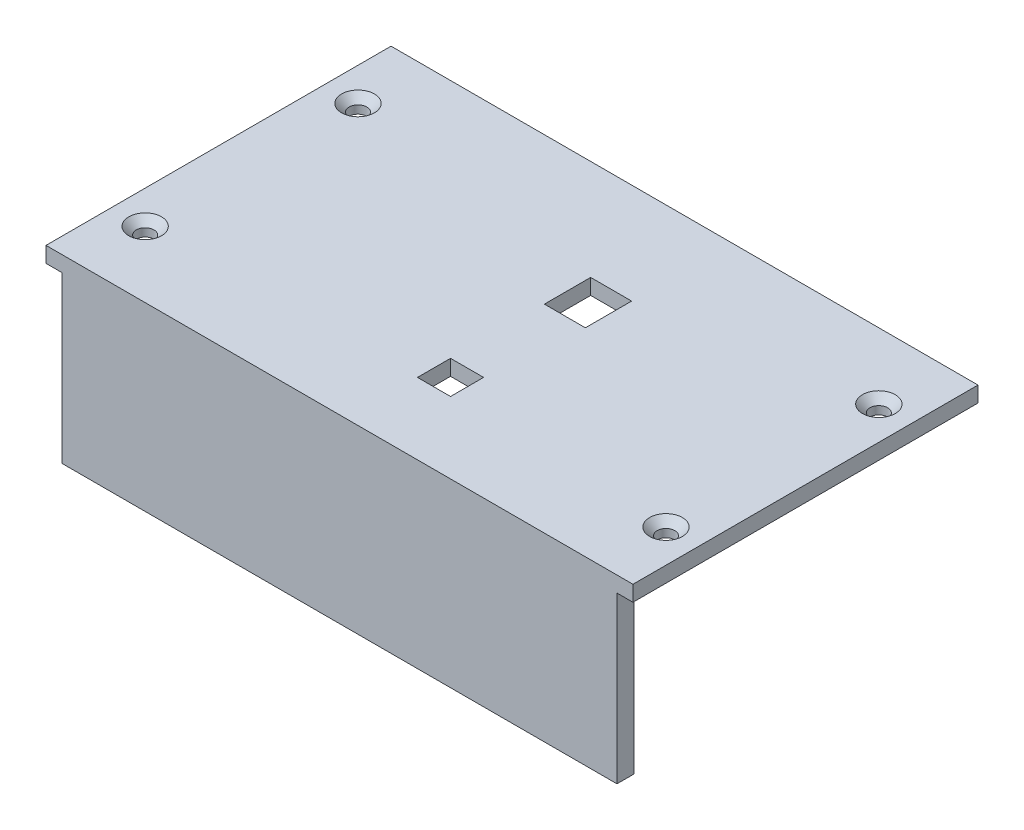
ISO-10303-21;
HEADER;
FILE_DESCRIPTION(('STEP AP214'),'2;1');
FILE_NAME('part.step','',(''),(''),'','','');
FILE_SCHEMA(('AUTOMOTIVE_DESIGN { 1 0 10303 214 1 1 1 1 }'));
ENDSEC;
DATA;
#1=APPLICATION_CONTEXT('core data for automotive mechanical design processes');
#2=APPLICATION_PROTOCOL_DEFINITION('international standard','automotive_design',2000,#1);
#3=PRODUCT_CONTEXT('',#1,'mechanical');
#4=PRODUCT('Part','Part','',(#3));
#5=PRODUCT_RELATED_PRODUCT_CATEGORY('part','',(#4));
#6=PRODUCT_DEFINITION_FORMATION('','',#4);
#7=PRODUCT_DEFINITION_CONTEXT('part definition',#1,'design');
#8=PRODUCT_DEFINITION('design','',#6,#7);
#9=PRODUCT_DEFINITION_SHAPE('','',#8);
#10=(LENGTH_UNIT() NAMED_UNIT(*) SI_UNIT(.MILLI.,.METRE.));
#11=(NAMED_UNIT(*) PLANE_ANGLE_UNIT() SI_UNIT($,.RADIAN.));
#12=(NAMED_UNIT(*) SI_UNIT($,.STERADIAN.) SOLID_ANGLE_UNIT());
#13=UNCERTAINTY_MEASURE_WITH_UNIT(LENGTH_MEASURE(1.E-05),#10,'distance_accuracy_value','');
#14=(GEOMETRIC_REPRESENTATION_CONTEXT(3) GLOBAL_UNCERTAINTY_ASSIGNED_CONTEXT((#13)) GLOBAL_UNIT_ASSIGNED_CONTEXT((#10,
#11,#12)) REPRESENTATION_CONTEXT('',''));
#15=CARTESIAN_POINT('',(0.,0.,0.));
#16=DIRECTION('',(0.,0.,1.));
#17=DIRECTION('',(1.,0.,0.));
#18=AXIS2_PLACEMENT_3D('',#15,#16,#17);
#19=CARTESIAN_POINT('',(0.,0.,0.));
#20=DIRECTION('',(0.,1.,0.));
#21=DIRECTION('',(0.,0.,1.));
#22=AXIS2_PLACEMENT_3D('',#19,#20,#21);
#23=PLANE('',#22);
#24=DIRECTION('',(1.,0.,0.));
#25=VECTOR('',#24,1.);
#26=CARTESIAN_POINT('',(1.27000000000001,0.,13.081));
#27=LINE('',#26,#25);
#28=CARTESIAN_POINT('',(1.27000000000001,0.,13.081));
#29=VERTEX_POINT('',#28);
#30=CARTESIAN_POINT('',(7.62000000000001,0.,13.081));
#31=VERTEX_POINT('',#30);
#32=EDGE_CURVE('E178',#29,#31,#27,.T.);
#33=ORIENTED_EDGE('',*,*,#32,.F.);
#34=DIRECTION('',(0.,0.,-1.));
#35=VECTOR('',#34,1.);
#36=CARTESIAN_POINT('',(1.27000000000001,0.,13.081));
#37=LINE('',#36,#35);
#38=CARTESIAN_POINT('',(1.27000000000001,0.,19.431));
#39=VERTEX_POINT('',#38);
#40=EDGE_CURVE('E157',#39,#29,#37,.T.);
#41=ORIENTED_EDGE('',*,*,#40,.F.);
#42=DIRECTION('',(-1.,0.,0.));
#43=VECTOR('',#42,1.);
#44=CARTESIAN_POINT('',(1.27000000000001,0.,19.431));
#45=LINE('',#44,#43);
#46=CARTESIAN_POINT('',(7.62000000000001,0.,19.431));
#47=VERTEX_POINT('',#46);
#48=EDGE_CURVE('E169',#47,#39,#45,.T.);
#49=ORIENTED_EDGE('',*,*,#48,.F.);
#50=DIRECTION('',(0.,0.,1.));
#51=VECTOR('',#50,1.);
#52=CARTESIAN_POINT('',(7.62000000000001,0.,13.081));
#53=LINE('',#52,#51);
#54=EDGE_CURVE('E55',#31,#47,#53,.T.);
#55=ORIENTED_EDGE('',*,*,#54,.F.);
#56=EDGE_LOOP('',(#33,#41,#49,#55));
#57=FACE_BOUND('',#56,.T.);
#58=DIRECTION('',(1.,0.,0.));
#59=VECTOR('',#58,1.);
#60=CARTESIAN_POINT('',(1.27,0.,-13.843));
#61=LINE('',#60,#59);
#62=CARTESIAN_POINT('',(1.27,0.,-13.843));
#63=VERTEX_POINT('',#62);
#64=CARTESIAN_POINT('',(9.144,0.,-13.843));
#65=VERTEX_POINT('',#64);
#66=EDGE_CURVE('E206',#63,#65,#61,.T.);
#67=ORIENTED_EDGE('',*,*,#66,.F.);
#68=DIRECTION('',(0.,0.,-1.));
#69=VECTOR('',#68,1.);
#70=CARTESIAN_POINT('',(1.27,0.,-13.843));
#71=LINE('',#70,#69);
#72=CARTESIAN_POINT('',(1.27000000000001,0.,-4.953));
#73=VERTEX_POINT('',#72);
#74=EDGE_CURVE('E210',#73,#63,#71,.T.);
#75=ORIENTED_EDGE('',*,*,#74,.F.);
#76=DIRECTION('',(-1.,0.,0.));
#77=VECTOR('',#76,1.);
#78=CARTESIAN_POINT('',(1.27000000000001,0.,-4.953));
#79=LINE('',#78,#77);
#80=CARTESIAN_POINT('',(9.144,0.,-4.953));
#81=VERTEX_POINT('',#80);
#82=EDGE_CURVE('E233',#81,#73,#79,.T.);
#83=ORIENTED_EDGE('',*,*,#82,.F.);
#84=DIRECTION('',(0.,0.,1.));
#85=VECTOR('',#84,1.);
#86=CARTESIAN_POINT('',(9.144,0.,-13.843));
#87=LINE('',#86,#85);
#88=EDGE_CURVE('E63',#65,#81,#87,.T.);
#89=ORIENTED_EDGE('',*,*,#88,.F.);
#90=EDGE_LOOP('',(#67,#75,#83,#89));
#91=FACE_BOUND('',#90,.T.);
#92=CARTESIAN_POINT('',(50.038,0.,-20.447));
#93=DIRECTION('',(0.,1.,0.));
#94=DIRECTION('',(0.,0.,1.));
#95=AXIS2_PLACEMENT_3D('',#92,#93,#94);
#96=CIRCLE('',#95,1.69999999999999);
#97=CARTESIAN_POINT('',(50.038,0.,-18.747));
#98=VERTEX_POINT('',#97);
#99=EDGE_CURVE('E331',#98,#98,#96,.T.);
#100=ORIENTED_EDGE('',*,*,#99,.T.);
#101=EDGE_LOOP('',(#100));
#102=FACE_BOUND('',#101,.T.);
#103=CARTESIAN_POINT('',(50.038,0.,20.447));
#104=DIRECTION('',(0.,1.,0.));
#105=DIRECTION('',(0.,0.,1.));
#106=AXIS2_PLACEMENT_3D('',#103,#104,#105);
#107=CIRCLE('',#106,1.69999999999999);
#108=CARTESIAN_POINT('',(50.038,0.,22.147));
#109=VERTEX_POINT('',#108);
#110=EDGE_CURVE('E319',#109,#109,#107,.T.);
#111=ORIENTED_EDGE('',*,*,#110,.T.);
#112=EDGE_LOOP('',(#111));
#113=FACE_BOUND('',#112,.T.);
#114=CARTESIAN_POINT('',(-50.038,0.,20.447));
#115=DIRECTION('',(0.,1.,0.));
#116=DIRECTION('',(0.,0.,1.));
#117=AXIS2_PLACEMENT_3D('',#114,#115,#116);
#118=CIRCLE('',#117,1.69999999999999);
#119=CARTESIAN_POINT('',(-50.038,0.,22.147));
#120=VERTEX_POINT('',#119);
#121=EDGE_CURVE('E307',#120,#120,#118,.T.);
#122=ORIENTED_EDGE('',*,*,#121,.T.);
#123=EDGE_LOOP('',(#122));
#124=FACE_BOUND('',#123,.T.);
#125=CARTESIAN_POINT('',(-50.038,0.,-20.447));
#126=DIRECTION('',(0.,1.,0.));
#127=DIRECTION('',(0.,0.,1.));
#128=AXIS2_PLACEMENT_3D('',#125,#126,#127);
#129=CIRCLE('',#128,1.69999999999999);
#130=CARTESIAN_POINT('',(-50.038,0.,-18.747));
#131=VERTEX_POINT('',#130);
#132=EDGE_CURVE('E295',#131,#131,#129,.T.);
#133=ORIENTED_EDGE('',*,*,#132,.T.);
#134=EDGE_LOOP('',(#133));
#135=FACE_BOUND('',#134,.T.);
#136=DIRECTION('',(0.,0.,-1.));
#137=VECTOR('',#136,1.);
#138=CARTESIAN_POINT('',(-53.3146,0.,33.147));
#139=LINE('',#138,#137);
#140=CARTESIAN_POINT('',(-53.3146,0.,33.147));
#141=VERTEX_POINT('',#140);
#142=CARTESIAN_POINT('',(-53.3146,0.,29.845));
#143=VERTEX_POINT('',#142);
#144=EDGE_CURVE('E173',#141,#143,#139,.T.);
#145=ORIENTED_EDGE('',*,*,#144,.F.);
#146=DIRECTION('',(1.,0.,0.));
#147=VECTOR('',#146,1.);
#148=CARTESIAN_POINT('',(-56.388,0.,33.147));
#149=LINE('',#148,#147);
#150=CARTESIAN_POINT('',(-56.388,0.,33.147));
#151=VERTEX_POINT('',#150);
#152=EDGE_CURVE('E353',#151,#141,#149,.T.);
#153=ORIENTED_EDGE('',*,*,#152,.F.);
#154=DIRECTION('',(0.,0.,-1.));
#155=VECTOR('',#154,1.);
#156=CARTESIAN_POINT('',(-56.388,0.,33.147));
#157=LINE('',#156,#155);
#158=CARTESIAN_POINT('',(-56.388,0.,-33.147));
#159=VERTEX_POINT('',#158);
#160=EDGE_CURVE('E341',#151,#159,#157,.T.);
#161=ORIENTED_EDGE('',*,*,#160,.T.);
#162=DIRECTION('',(1.,0.,0.));
#163=VECTOR('',#162,1.);
#164=CARTESIAN_POINT('',(-56.388,0.,-33.147));
#165=LINE('',#164,#163);
#166=CARTESIAN_POINT('',(56.388,0.,-33.147));
#167=VERTEX_POINT('',#166);
#168=EDGE_CURVE('E361',#159,#167,#165,.T.);
#169=ORIENTED_EDGE('',*,*,#168,.T.);
#170=DIRECTION('',(0.,0.,-1.));
#171=VECTOR('',#170,1.);
#172=CARTESIAN_POINT('',(56.388,0.,33.147));
#173=LINE('',#172,#171);
#174=CARTESIAN_POINT('',(56.388,0.,33.147));
#175=VERTEX_POINT('',#174);
#176=EDGE_CURVE('E357',#175,#167,#173,.T.);
#177=ORIENTED_EDGE('',*,*,#176,.F.);
#178=CARTESIAN_POINT('',(53.3146,0.,33.147));
#179=VERTEX_POINT('',#178);
#180=EDGE_CURVE('E335',#179,#175,#149,.T.);
#181=ORIENTED_EDGE('',*,*,#180,.F.);
#182=DIRECTION('',(0.,0.,-1.));
#183=VECTOR('',#182,1.);
#184=CARTESIAN_POINT('',(53.3146,0.,33.147));
#185=LINE('',#184,#183);
#186=CARTESIAN_POINT('',(53.3146,0.,29.845));
#187=VERTEX_POINT('',#186);
#188=EDGE_CURVE('E251',#179,#187,#185,.T.);
#189=ORIENTED_EDGE('',*,*,#188,.T.);
#190=DIRECTION('',(1.,0.,0.));
#191=VECTOR('',#190,1.);
#192=CARTESIAN_POINT('',(-53.3146,0.,29.845));
#193=LINE('',#192,#191);
#194=EDGE_CURVE('E266',#143,#187,#193,.T.);
#195=ORIENTED_EDGE('',*,*,#194,.F.);
#196=EDGE_LOOP('',(#145,#153,#161,#169,#177,#181,#189,#195));
#197=FACE_BOUND('',#196,.T.);
#198=ADVANCED_FACE('F39',(#57,#91,#102,#113,#124,#135,#197),#23,.F.);
#199=CARTESIAN_POINT('',(-56.388,3.,33.147));
#200=DIRECTION('',(0.,0.,-1.));
#201=DIRECTION('',(-1.,0.,0.));
#202=AXIS2_PLACEMENT_3D('',#199,#200,#201);
#203=PLANE('',#202);
#204=ORIENTED_EDGE('',*,*,#152,.T.);
#205=DIRECTION('',(0.,1.,0.));
#206=VECTOR('',#205,1.);
#207=CARTESIAN_POINT('',(-53.3146,-31.75,33.147));
#208=LINE('',#207,#206);
#209=CARTESIAN_POINT('',(-53.3146,-31.75,33.147));
#210=VERTEX_POINT('',#209);
#211=EDGE_CURVE('E262',#210,#141,#208,.T.);
#212=ORIENTED_EDGE('',*,*,#211,.F.);
#213=DIRECTION('',(1.,0.,0.));
#214=VECTOR('',#213,1.);
#215=CARTESIAN_POINT('',(-53.3146,-31.75,33.147));
#216=LINE('',#215,#214);
#217=CARTESIAN_POINT('',(53.3146,-31.75,33.147));
#218=VERTEX_POINT('',#217);
#219=EDGE_CURVE('E258',#210,#218,#216,.T.);
#220=ORIENTED_EDGE('',*,*,#219,.T.);
#221=DIRECTION('',(0.,1.,0.));
#222=VECTOR('',#221,1.);
#223=CARTESIAN_POINT('',(53.3146,-31.75,33.147));
#224=LINE('',#223,#222);
#225=EDGE_CURVE('E275',#218,#179,#224,.T.);
#226=ORIENTED_EDGE('',*,*,#225,.T.);
#227=ORIENTED_EDGE('',*,*,#180,.T.);
#228=DIRECTION('',(0.,-1.,0.));
#229=VECTOR('',#228,1.);
#230=CARTESIAN_POINT('',(56.388,3.,33.147));
#231=LINE('',#230,#229);
#232=CARTESIAN_POINT('',(56.388,3.,33.147));
#233=VERTEX_POINT('',#232);
#234=EDGE_CURVE('E11',#233,#175,#231,.T.);
#235=ORIENTED_EDGE('',*,*,#234,.F.);
#236=DIRECTION('',(1.,0.,0.));
#237=VECTOR('',#236,1.);
#238=CARTESIAN_POINT('',(-56.388,3.,33.147));
#239=LINE('',#238,#237);
#240=CARTESIAN_POINT('',(-56.388,3.,33.147));
#241=VERTEX_POINT('',#240);
#242=EDGE_CURVE('E336',#241,#233,#239,.T.);
#243=ORIENTED_EDGE('',*,*,#242,.F.);
#244=DIRECTION('',(0.,-1.,0.));
#245=VECTOR('',#244,1.);
#246=CARTESIAN_POINT('',(-56.388,3.,33.147));
#247=LINE('',#246,#245);
#248=EDGE_CURVE('E352',#241,#151,#247,.T.);
#249=ORIENTED_EDGE('',*,*,#248,.T.);
#250=EDGE_LOOP('',(#204,#212,#220,#226,#227,#235,#243,#249));
#251=FACE_BOUND('',#250,.T.);
#252=ADVANCED_FACE('F41',(#251),#203,.F.);
#253=CARTESIAN_POINT('',(56.388,3.,33.147));
#254=DIRECTION('',(-1.,0.,0.));
#255=DIRECTION('',(0.,0.,1.));
#256=AXIS2_PLACEMENT_3D('',#253,#254,#255);
#257=PLANE('',#256);
#258=ORIENTED_EDGE('',*,*,#176,.T.);
#259=DIRECTION('',(0.,-1.,0.));
#260=VECTOR('',#259,1.);
#261=CARTESIAN_POINT('',(56.388,3.,-33.147));
#262=LINE('',#261,#260);
#263=CARTESIAN_POINT('',(56.388,3.,-33.147));
#264=VERTEX_POINT('',#263);
#265=EDGE_CURVE('E48',#264,#167,#262,.T.);
#266=ORIENTED_EDGE('',*,*,#265,.F.);
#267=DIRECTION('',(0.,0.,-1.));
#268=VECTOR('',#267,1.);
#269=CARTESIAN_POINT('',(56.388,3.,33.147));
#270=LINE('',#269,#268);
#271=EDGE_CURVE('E340',#233,#264,#270,.T.);
#272=ORIENTED_EDGE('',*,*,#271,.F.);
#273=ORIENTED_EDGE('',*,*,#234,.T.);
#274=EDGE_LOOP('',(#258,#266,#272,#273));
#275=FACE_BOUND('',#274,.T.);
#276=ADVANCED_FACE('F380',(#275),#257,.F.);
#277=CARTESIAN_POINT('',(-56.388,3.,-33.147));
#278=DIRECTION('',(0.,0.,-1.));
#279=DIRECTION('',(-1.,0.,0.));
#280=AXIS2_PLACEMENT_3D('',#277,#278,#279);
#281=PLANE('',#280);
#282=ORIENTED_EDGE('',*,*,#168,.F.);
#283=DIRECTION('',(0.,-1.,0.));
#284=VECTOR('',#283,1.);
#285=CARTESIAN_POINT('',(-56.388,3.,-33.147));
#286=LINE('',#285,#284);
#287=CARTESIAN_POINT('',(-56.388,3.,-33.147));
#288=VERTEX_POINT('',#287);
#289=EDGE_CURVE('E370',#288,#159,#286,.T.);
#290=ORIENTED_EDGE('',*,*,#289,.F.);
#291=DIRECTION('',(1.,0.,0.));
#292=VECTOR('',#291,1.);
#293=CARTESIAN_POINT('',(-56.388,3.,-33.147));
#294=LINE('',#293,#292);
#295=EDGE_CURVE('E344',#288,#264,#294,.T.);
#296=ORIENTED_EDGE('',*,*,#295,.T.);
#297=ORIENTED_EDGE('',*,*,#265,.T.);
#298=EDGE_LOOP('',(#282,#290,#296,#297));
#299=FACE_BOUND('',#298,.T.);
#300=ADVANCED_FACE('F376',(#299),#281,.T.);
#301=CARTESIAN_POINT('',(-56.388,3.,33.147));
#302=DIRECTION('',(-1.,0.,0.));
#303=DIRECTION('',(0.,0.,1.));
#304=AXIS2_PLACEMENT_3D('',#301,#302,#303);
#305=PLANE('',#304);
#306=ORIENTED_EDGE('',*,*,#160,.F.);
#307=ORIENTED_EDGE('',*,*,#248,.F.);
#308=DIRECTION('',(0.,0.,-1.));
#309=VECTOR('',#308,1.);
#310=CARTESIAN_POINT('',(-56.388,3.,33.147));
#311=LINE('',#310,#309);
#312=EDGE_CURVE('E348',#241,#288,#311,.T.);
#313=ORIENTED_EDGE('',*,*,#312,.T.);
#314=ORIENTED_EDGE('',*,*,#289,.T.);
#315=EDGE_LOOP('',(#306,#307,#313,#314));
#316=FACE_BOUND('',#315,.T.);
#317=ADVANCED_FACE('F386',(#316),#305,.T.);
#318=CARTESIAN_POINT('',(0.,3.,0.));
#319=DIRECTION('',(0.,1.,0.));
#320=DIRECTION('',(0.,0.,1.));
#321=AXIS2_PLACEMENT_3D('',#318,#319,#320);
#322=PLANE('',#321);
#323=DIRECTION('',(0.,0.,1.));
#324=VECTOR('',#323,1.);
#325=CARTESIAN_POINT('',(1.27000000000001,3.,13.081));
#326=LINE('',#325,#324);
#327=CARTESIAN_POINT('',(1.27000000000001,3.,13.081));
#328=VERTEX_POINT('',#327);
#329=CARTESIAN_POINT('',(1.27000000000001,3.,19.431));
#330=VERTEX_POINT('',#329);
#331=EDGE_CURVE('E160',#328,#330,#326,.T.);
#332=ORIENTED_EDGE('',*,*,#331,.F.);
#333=DIRECTION('',(-1.,0.,0.));
#334=VECTOR('',#333,1.);
#335=CARTESIAN_POINT('',(1.27000000000001,3.,13.081));
#336=LINE('',#335,#334);
#337=CARTESIAN_POINT('',(7.62000000000001,3.,13.081));
#338=VERTEX_POINT('',#337);
#339=EDGE_CURVE('E166',#338,#328,#336,.T.);
#340=ORIENTED_EDGE('',*,*,#339,.F.);
#341=DIRECTION('',(0.,0.,-1.));
#342=VECTOR('',#341,1.);
#343=CARTESIAN_POINT('',(7.62000000000001,3.,13.081));
#344=LINE('',#343,#342);
#345=CARTESIAN_POINT('',(7.62000000000001,3.,19.431));
#346=VERTEX_POINT('',#345);
#347=EDGE_CURVE('E190',#346,#338,#344,.T.);
#348=ORIENTED_EDGE('',*,*,#347,.F.);
#349=DIRECTION('',(1.,0.,0.));
#350=VECTOR('',#349,1.);
#351=CARTESIAN_POINT('',(1.27000000000001,3.,19.431));
#352=LINE('',#351,#350);
#353=EDGE_CURVE('E183',#330,#346,#352,.T.);
#354=ORIENTED_EDGE('',*,*,#353,.F.);
#355=EDGE_LOOP('',(#332,#340,#348,#354));
#356=FACE_BOUND('',#355,.T.);
#357=DIRECTION('',(0.,0.,1.));
#358=VECTOR('',#357,1.);
#359=CARTESIAN_POINT('',(1.27,3.,-13.843));
#360=LINE('',#359,#358);
#361=CARTESIAN_POINT('',(1.27,3.,-13.843));
#362=VERTEX_POINT('',#361);
#363=CARTESIAN_POINT('',(1.27000000000001,3.,-4.953));
#364=VERTEX_POINT('',#363);
#365=EDGE_CURVE('E214',#362,#364,#360,.T.);
#366=ORIENTED_EDGE('',*,*,#365,.F.);
#367=DIRECTION('',(-1.,0.,0.));
#368=VECTOR('',#367,1.);
#369=CARTESIAN_POINT('',(1.27,3.,-13.843));
#370=LINE('',#369,#368);
#371=CARTESIAN_POINT('',(9.144,3.,-13.843));
#372=VERTEX_POINT('',#371);
#373=EDGE_CURVE('E225',#372,#362,#370,.T.);
#374=ORIENTED_EDGE('',*,*,#373,.F.);
#375=DIRECTION('',(0.,0.,-1.));
#376=VECTOR('',#375,1.);
#377=CARTESIAN_POINT('',(9.144,3.,-13.843));
#378=LINE('',#377,#376);
#379=CARTESIAN_POINT('',(9.144,3.,-4.953));
#380=VERTEX_POINT('',#379);
#381=EDGE_CURVE('E221',#380,#372,#378,.T.);
#382=ORIENTED_EDGE('',*,*,#381,.F.);
#383=DIRECTION('',(1.,0.,0.));
#384=VECTOR('',#383,1.);
#385=CARTESIAN_POINT('',(1.27000000000001,3.,-4.953));
#386=LINE('',#385,#384);
#387=EDGE_CURVE('E217',#364,#380,#386,.T.);
#388=ORIENTED_EDGE('',*,*,#387,.F.);
#389=EDGE_LOOP('',(#366,#374,#382,#388));
#390=FACE_BOUND('',#389,.T.);
#391=CARTESIAN_POINT('',(-50.038,3.,-20.447));
#392=DIRECTION('',(0.,1.,0.));
#393=DIRECTION('',(0.,0.,1.));
#394=AXIS2_PLACEMENT_3D('',#391,#392,#393);
#395=CIRCLE('',#394,3.15);
#396=CARTESIAN_POINT('',(-50.038,3.,-17.297));
#397=VERTEX_POINT('',#396);
#398=EDGE_CURVE('E287',#397,#397,#395,.T.);
#399=ORIENTED_EDGE('',*,*,#398,.F.);
#400=EDGE_LOOP('',(#399));
#401=FACE_BOUND('',#400,.T.);
#402=CARTESIAN_POINT('',(-50.038,3.,20.447));
#403=DIRECTION('',(0.,1.,0.));
#404=DIRECTION('',(0.,0.,1.));
#405=AXIS2_PLACEMENT_3D('',#402,#403,#404);
#406=CIRCLE('',#405,3.15);
#407=CARTESIAN_POINT('',(-50.038,3.,23.597));
#408=VERTEX_POINT('',#407);
#409=EDGE_CURVE('E299',#408,#408,#406,.T.);
#410=ORIENTED_EDGE('',*,*,#409,.F.);
#411=EDGE_LOOP('',(#410));
#412=FACE_BOUND('',#411,.T.);
#413=CARTESIAN_POINT('',(50.038,3.,20.447));
#414=DIRECTION('',(0.,1.,0.));
#415=DIRECTION('',(0.,0.,1.));
#416=AXIS2_PLACEMENT_3D('',#413,#414,#415);
#417=CIRCLE('',#416,3.15);
#418=CARTESIAN_POINT('',(50.038,3.,23.597));
#419=VERTEX_POINT('',#418);
#420=EDGE_CURVE('E311',#419,#419,#417,.T.);
#421=ORIENTED_EDGE('',*,*,#420,.F.);
#422=EDGE_LOOP('',(#421));
#423=FACE_BOUND('',#422,.T.);
#424=CARTESIAN_POINT('',(50.038,3.,-20.447));
#425=DIRECTION('',(0.,1.,0.));
#426=DIRECTION('',(0.,0.,1.));
#427=AXIS2_PLACEMENT_3D('',#424,#425,#426);
#428=CIRCLE('',#427,3.15);
#429=CARTESIAN_POINT('',(50.038,3.,-17.297));
#430=VERTEX_POINT('',#429);
#431=EDGE_CURVE('E323',#430,#430,#428,.T.);
#432=ORIENTED_EDGE('',*,*,#431,.F.);
#433=EDGE_LOOP('',(#432));
#434=FACE_BOUND('',#433,.T.);
#435=ORIENTED_EDGE('',*,*,#242,.T.);
#436=ORIENTED_EDGE('',*,*,#271,.T.);
#437=ORIENTED_EDGE('',*,*,#295,.F.);
#438=ORIENTED_EDGE('',*,*,#312,.F.);
#439=EDGE_LOOP('',(#435,#436,#437,#438));
#440=FACE_BOUND('',#439,.T.);
#441=ADVANCED_FACE('F390',(#356,#390,#401,#412,#423,#434,#440),#322,.T.);
#442=CARTESIAN_POINT('',(50.038,3.,-20.447));
#443=DIRECTION('',(0.,1.,0.));
#444=DIRECTION('',(0.,0.,1.));
#445=AXIS2_PLACEMENT_3D('',#442,#443,#444);
#446=CYLINDRICAL_SURFACE('',#445,1.69999999999999);
#447=ORIENTED_EDGE('',*,*,#99,.F.);
#448=EDGE_LOOP('',(#447));
#449=FACE_BOUND('',#448,.T.);
#450=CARTESIAN_POINT('',(50.038,1.54999999999999,-20.447));
#451=DIRECTION('',(0.,1.,0.));
#452=DIRECTION('',(0.,0.,1.));
#453=AXIS2_PLACEMENT_3D('',#450,#451,#452);
#454=CIRCLE('',#453,1.69999999999999);
#455=CARTESIAN_POINT('',(50.038,1.54999999999999,-18.747));
#456=VERTEX_POINT('',#455);
#457=EDGE_CURVE('E327',#456,#456,#454,.T.);
#458=ORIENTED_EDGE('',*,*,#457,.T.);
#459=EDGE_LOOP('',(#458));
#460=FACE_BOUND('',#459,.T.);
#461=ADVANCED_FACE('F448',(#449,#460),#446,.F.);
#462=CARTESIAN_POINT('',(50.038,3.,-20.447));
#463=DIRECTION('',(0.,1.,0.));
#464=DIRECTION('',(0.,0.,1.));
#465=AXIS2_PLACEMENT_3D('',#462,#463,#464);
#466=CONICAL_SURFACE('',#465,3.15,0.78539816339745);
#467=ORIENTED_EDGE('',*,*,#457,.F.);
#468=EDGE_LOOP('',(#467));
#469=FACE_BOUND('',#468,.T.);
#470=ORIENTED_EDGE('',*,*,#431,.T.);
#471=EDGE_LOOP('',(#470));
#472=FACE_BOUND('',#471,.T.);
#473=ADVANCED_FACE('F457',(#469,#472),#466,.F.);
#474=CARTESIAN_POINT('',(50.038,3.,20.447));
#475=DIRECTION('',(0.,1.,0.));
#476=DIRECTION('',(0.,0.,1.));
#477=AXIS2_PLACEMENT_3D('',#474,#475,#476);
#478=CYLINDRICAL_SURFACE('',#477,1.69999999999999);
#479=ORIENTED_EDGE('',*,*,#110,.F.);
#480=EDGE_LOOP('',(#479));
#481=FACE_BOUND('',#480,.T.);
#482=CARTESIAN_POINT('',(50.038,1.54999999999999,20.447));
#483=DIRECTION('',(0.,1.,0.));
#484=DIRECTION('',(0.,0.,1.));
#485=AXIS2_PLACEMENT_3D('',#482,#483,#484);
#486=CIRCLE('',#485,1.69999999999999);
#487=CARTESIAN_POINT('',(50.038,1.54999999999999,22.147));
#488=VERTEX_POINT('',#487);
#489=EDGE_CURVE('E315',#488,#488,#486,.T.);
#490=ORIENTED_EDGE('',*,*,#489,.T.);
#491=EDGE_LOOP('',(#490));
#492=FACE_BOUND('',#491,.T.);
#493=ADVANCED_FACE('F463',(#481,#492),#478,.F.);
#494=CARTESIAN_POINT('',(50.038,3.,20.447));
#495=DIRECTION('',(0.,1.,0.));
#496=DIRECTION('',(0.,0.,1.));
#497=AXIS2_PLACEMENT_3D('',#494,#495,#496);
#498=CONICAL_SURFACE('',#497,3.15,0.78539816339745);
#499=ORIENTED_EDGE('',*,*,#489,.F.);
#500=EDGE_LOOP('',(#499));
#501=FACE_BOUND('',#500,.T.);
#502=ORIENTED_EDGE('',*,*,#420,.T.);
#503=EDGE_LOOP('',(#502));
#504=FACE_BOUND('',#503,.T.);
#505=ADVANCED_FACE('F471',(#501,#504),#498,.F.);
#506=CARTESIAN_POINT('',(-50.038,3.,20.447));
#507=DIRECTION('',(0.,1.,0.));
#508=DIRECTION('',(0.,0.,1.));
#509=AXIS2_PLACEMENT_3D('',#506,#507,#508);
#510=CYLINDRICAL_SURFACE('',#509,1.69999999999999);
#511=ORIENTED_EDGE('',*,*,#121,.F.);
#512=EDGE_LOOP('',(#511));
#513=FACE_BOUND('',#512,.T.);
#514=CARTESIAN_POINT('',(-50.038,1.54999999999999,20.447));
#515=DIRECTION('',(0.,1.,0.));
#516=DIRECTION('',(0.,0.,1.));
#517=AXIS2_PLACEMENT_3D('',#514,#515,#516);
#518=CIRCLE('',#517,1.69999999999999);
#519=CARTESIAN_POINT('',(-50.038,1.54999999999999,22.147));
#520=VERTEX_POINT('',#519);
#521=EDGE_CURVE('E303',#520,#520,#518,.T.);
#522=ORIENTED_EDGE('',*,*,#521,.T.);
#523=EDGE_LOOP('',(#522));
#524=FACE_BOUND('',#523,.T.);
#525=ADVANCED_FACE('F479',(#513,#524),#510,.F.);
#526=CARTESIAN_POINT('',(-50.038,3.,20.447));
#527=DIRECTION('',(0.,1.,0.));
#528=DIRECTION('',(0.,0.,1.));
#529=AXIS2_PLACEMENT_3D('',#526,#527,#528);
#530=CONICAL_SURFACE('',#529,3.15,0.78539816339745);
#531=ORIENTED_EDGE('',*,*,#521,.F.);
#532=EDGE_LOOP('',(#531));
#533=FACE_BOUND('',#532,.T.);
#534=ORIENTED_EDGE('',*,*,#409,.T.);
#535=EDGE_LOOP('',(#534));
#536=FACE_BOUND('',#535,.T.);
#537=ADVANCED_FACE('F487',(#533,#536),#530,.F.);
#538=CARTESIAN_POINT('',(-50.038,3.,-20.447));
#539=DIRECTION('',(0.,1.,0.));
#540=DIRECTION('',(0.,0.,1.));
#541=AXIS2_PLACEMENT_3D('',#538,#539,#540);
#542=CYLINDRICAL_SURFACE('',#541,1.69999999999999);
#543=ORIENTED_EDGE('',*,*,#132,.F.);
#544=EDGE_LOOP('',(#543));
#545=FACE_BOUND('',#544,.T.);
#546=CARTESIAN_POINT('',(-50.038,1.54999999999999,-20.447));
#547=DIRECTION('',(0.,1.,0.));
#548=DIRECTION('',(0.,0.,1.));
#549=AXIS2_PLACEMENT_3D('',#546,#547,#548);
#550=CIRCLE('',#549,1.69999999999999);
#551=CARTESIAN_POINT('',(-50.038,1.54999999999999,-18.747));
#552=VERTEX_POINT('',#551);
#553=EDGE_CURVE('E291',#552,#552,#550,.T.);
#554=ORIENTED_EDGE('',*,*,#553,.T.);
#555=EDGE_LOOP('',(#554));
#556=FACE_BOUND('',#555,.T.);
#557=ADVANCED_FACE('F495',(#545,#556),#542,.F.);
#558=CARTESIAN_POINT('',(-50.038,3.,-20.447));
#559=DIRECTION('',(0.,1.,0.));
#560=DIRECTION('',(0.,0.,1.));
#561=AXIS2_PLACEMENT_3D('',#558,#559,#560);
#562=CONICAL_SURFACE('',#561,3.15,0.78539816339745);
#563=ORIENTED_EDGE('',*,*,#553,.F.);
#564=EDGE_LOOP('',(#563));
#565=FACE_BOUND('',#564,.T.);
#566=ORIENTED_EDGE('',*,*,#398,.T.);
#567=EDGE_LOOP('',(#566));
#568=FACE_BOUND('',#567,.T.);
#569=ADVANCED_FACE('F503',(#565,#568),#562,.F.);
#570=CARTESIAN_POINT('',(-53.3146,-31.75,33.147));
#571=DIRECTION('',(1.,0.,0.));
#572=DIRECTION('',(0.,0.,-1.));
#573=AXIS2_PLACEMENT_3D('',#570,#571,#572);
#574=PLANE('',#573);
#575=ORIENTED_EDGE('',*,*,#144,.T.);
#576=DIRECTION('',(0.,1.,0.));
#577=VECTOR('',#576,1.);
#578=CARTESIAN_POINT('',(-53.3146,-31.75,29.845));
#579=LINE('',#578,#577);
#580=CARTESIAN_POINT('',(-53.3146,-31.75,29.845));
#581=VERTEX_POINT('',#580);
#582=EDGE_CURVE('E283',#581,#143,#579,.T.);
#583=ORIENTED_EDGE('',*,*,#582,.F.);
#584=DIRECTION('',(0.,0.,-1.));
#585=VECTOR('',#584,1.);
#586=CARTESIAN_POINT('',(-53.3146,-31.75,33.147));
#587=LINE('',#586,#585);
#588=EDGE_CURVE('E246',#210,#581,#587,.T.);
#589=ORIENTED_EDGE('',*,*,#588,.F.);
#590=ORIENTED_EDGE('',*,*,#211,.T.);
#591=EDGE_LOOP('',(#575,#583,#589,#590));
#592=FACE_BOUND('',#591,.T.);
#593=ADVANCED_FACE('F403',(#592),#574,.F.);
#594=CARTESIAN_POINT('',(-53.3146,-31.75,29.845));
#595=DIRECTION('',(0.,0.,1.));
#596=DIRECTION('',(1.,0.,0.));
#597=AXIS2_PLACEMENT_3D('',#594,#595,#596);
#598=PLANE('',#597);
#599=ORIENTED_EDGE('',*,*,#194,.T.);
#600=DIRECTION('',(0.,1.,0.));
#601=VECTOR('',#600,1.);
#602=CARTESIAN_POINT('',(53.3146,-31.75,29.845));
#603=LINE('',#602,#601);
#604=CARTESIAN_POINT('',(53.3146,-31.75,29.845));
#605=VERTEX_POINT('',#604);
#606=EDGE_CURVE('E279',#605,#187,#603,.T.);
#607=ORIENTED_EDGE('',*,*,#606,.F.);
#608=DIRECTION('',(1.,0.,0.));
#609=VECTOR('',#608,1.);
#610=CARTESIAN_POINT('',(-53.3146,-31.75,29.845));
#611=LINE('',#610,#609);
#612=EDGE_CURVE('E250',#581,#605,#611,.T.);
#613=ORIENTED_EDGE('',*,*,#612,.F.);
#614=ORIENTED_EDGE('',*,*,#582,.T.);
#615=EDGE_LOOP('',(#599,#607,#613,#614));
#616=FACE_BOUND('',#615,.T.);
#617=ADVANCED_FACE('F399',(#616),#598,.F.);
#618=CARTESIAN_POINT('',(53.3146,-31.75,33.147));
#619=DIRECTION('',(1.,0.,0.));
#620=DIRECTION('',(0.,0.,-1.));
#621=AXIS2_PLACEMENT_3D('',#618,#619,#620);
#622=PLANE('',#621);
#623=ORIENTED_EDGE('',*,*,#188,.F.);
#624=ORIENTED_EDGE('',*,*,#225,.F.);
#625=DIRECTION('',(0.,0.,-1.));
#626=VECTOR('',#625,1.);
#627=CARTESIAN_POINT('',(53.3146,-31.75,33.147));
#628=LINE('',#627,#626);
#629=EDGE_CURVE('E254',#218,#605,#628,.T.);
#630=ORIENTED_EDGE('',*,*,#629,.T.);
#631=ORIENTED_EDGE('',*,*,#606,.T.);
#632=EDGE_LOOP('',(#623,#624,#630,#631));
#633=FACE_BOUND('',#632,.T.);
#634=ADVANCED_FACE('F396',(#633),#622,.T.);
#635=CARTESIAN_POINT('',(0.,-31.75,0.));
#636=DIRECTION('',(0.,-1.,0.));
#637=DIRECTION('',(0.,0.,-1.));
#638=AXIS2_PLACEMENT_3D('',#635,#636,#637);
#639=PLANE('',#638);
#640=ORIENTED_EDGE('',*,*,#588,.T.);
#641=ORIENTED_EDGE('',*,*,#612,.T.);
#642=ORIENTED_EDGE('',*,*,#629,.F.);
#643=ORIENTED_EDGE('',*,*,#219,.F.);
#644=EDGE_LOOP('',(#640,#641,#642,#643));
#645=FACE_BOUND('',#644,.T.);
#646=ADVANCED_FACE('F406',(#645),#639,.T.);
#647=CARTESIAN_POINT('',(1.27,-31.751,-13.843));
#648=DIRECTION('',(-1.,0.,0.));
#649=DIRECTION('',(0.,0.,1.));
#650=AXIS2_PLACEMENT_3D('',#647,#648,#649);
#651=PLANE('',#650);
#652=ORIENTED_EDGE('',*,*,#74,.T.);
#653=DIRECTION('',(0.,1.,0.));
#654=VECTOR('',#653,1.);
#655=CARTESIAN_POINT('',(1.27,-31.751,-13.843));
#656=LINE('',#655,#654);
#657=EDGE_CURVE('E230',#63,#362,#656,.T.);
#658=ORIENTED_EDGE('',*,*,#657,.T.);
#659=ORIENTED_EDGE('',*,*,#365,.T.);
#660=DIRECTION('',(0.,1.,0.));
#661=VECTOR('',#660,1.);
#662=CARTESIAN_POINT('',(1.27000000000001,-31.751,-4.953));
#663=LINE('',#662,#661);
#664=EDGE_CURVE('E229',#73,#364,#663,.T.);
#665=ORIENTED_EDGE('',*,*,#664,.F.);
#666=EDGE_LOOP('',(#652,#658,#659,#665));
#667=FACE_BOUND('',#666,.T.);
#668=ADVANCED_FACE('F408',(#667),#651,.F.);
#669=CARTESIAN_POINT('',(1.27,-31.751,-13.843));
#670=DIRECTION('',(0.,0.,-1.));
#671=DIRECTION('',(-1.,0.,0.));
#672=AXIS2_PLACEMENT_3D('',#669,#670,#671);
#673=PLANE('',#672);
#674=ORIENTED_EDGE('',*,*,#66,.T.);
#675=DIRECTION('',(0.,1.,0.));
#676=VECTOR('',#675,1.);
#677=CARTESIAN_POINT('',(9.144,-31.751,-13.843));
#678=LINE('',#677,#676);
#679=EDGE_CURVE('E234',#65,#372,#678,.T.);
#680=ORIENTED_EDGE('',*,*,#679,.T.);
#681=ORIENTED_EDGE('',*,*,#373,.T.);
#682=ORIENTED_EDGE('',*,*,#657,.F.);
#683=EDGE_LOOP('',(#674,#680,#681,#682));
#684=FACE_BOUND('',#683,.T.);
#685=ADVANCED_FACE('F414',(#684),#673,.F.);
#686=CARTESIAN_POINT('',(9.144,-31.751,-13.843));
#687=DIRECTION('',(1.,0.,0.));
#688=DIRECTION('',(0.,0.,-1.));
#689=AXIS2_PLACEMENT_3D('',#686,#687,#688);
#690=PLANE('',#689);
#691=ORIENTED_EDGE('',*,*,#88,.T.);
#692=DIRECTION('',(0.,1.,0.));
#693=VECTOR('',#692,1.);
#694=CARTESIAN_POINT('',(9.144,-31.751,-4.953));
#695=LINE('',#694,#693);
#696=EDGE_CURVE('E237',#81,#380,#695,.T.);
#697=ORIENTED_EDGE('',*,*,#696,.T.);
#698=ORIENTED_EDGE('',*,*,#381,.T.);
#699=ORIENTED_EDGE('',*,*,#679,.F.);
#700=EDGE_LOOP('',(#691,#697,#698,#699));
#701=FACE_BOUND('',#700,.T.);
#702=ADVANCED_FACE('F554',(#701),#690,.F.);
#703=CARTESIAN_POINT('',(1.27000000000001,-31.751,-4.953));
#704=DIRECTION('',(0.,0.,1.));
#705=DIRECTION('',(1.,0.,0.));
#706=AXIS2_PLACEMENT_3D('',#703,#704,#705);
#707=PLANE('',#706);
#708=ORIENTED_EDGE('',*,*,#82,.T.);
#709=ORIENTED_EDGE('',*,*,#664,.T.);
#710=ORIENTED_EDGE('',*,*,#387,.T.);
#711=ORIENTED_EDGE('',*,*,#696,.F.);
#712=EDGE_LOOP('',(#708,#709,#710,#711));
#713=FACE_BOUND('',#712,.T.);
#714=ADVANCED_FACE('F563',(#713),#707,.F.);
#715=CARTESIAN_POINT('',(1.27000000000001,-31.751,13.081));
#716=DIRECTION('',(-1.,0.,0.));
#717=DIRECTION('',(0.,0.,1.));
#718=AXIS2_PLACEMENT_3D('',#715,#716,#717);
#719=PLANE('',#718);
#720=ORIENTED_EDGE('',*,*,#40,.T.);
#721=DIRECTION('',(0.,1.,0.));
#722=VECTOR('',#721,1.);
#723=CARTESIAN_POINT('',(1.27000000000001,-31.751,13.081));
#724=LINE('',#723,#722);
#725=EDGE_CURVE('E174',#29,#328,#724,.T.);
#726=ORIENTED_EDGE('',*,*,#725,.T.);
#727=ORIENTED_EDGE('',*,*,#331,.T.);
#728=DIRECTION('',(0.,1.,0.));
#729=VECTOR('',#728,1.);
#730=CARTESIAN_POINT('',(1.27000000000001,-31.751,19.431));
#731=LINE('',#730,#729);
#732=EDGE_CURVE('E153',#39,#330,#731,.T.);
#733=ORIENTED_EDGE('',*,*,#732,.F.);
#734=EDGE_LOOP('',(#720,#726,#727,#733));
#735=FACE_BOUND('',#734,.T.);
#736=ADVANCED_FACE('F155',(#735),#719,.F.);
#737=CARTESIAN_POINT('',(1.27000000000001,-31.751,13.081));
#738=DIRECTION('',(0.,0.,-1.));
#739=DIRECTION('',(-1.,0.,0.));
#740=AXIS2_PLACEMENT_3D('',#737,#738,#739);
#741=PLANE('',#740);
#742=ORIENTED_EDGE('',*,*,#32,.T.);
#743=DIRECTION('',(0.,1.,0.));
#744=VECTOR('',#743,1.);
#745=CARTESIAN_POINT('',(7.62000000000001,-31.751,13.081));
#746=LINE('',#745,#744);
#747=EDGE_CURVE('E199',#31,#338,#746,.T.);
#748=ORIENTED_EDGE('',*,*,#747,.T.);
#749=ORIENTED_EDGE('',*,*,#339,.T.);
#750=ORIENTED_EDGE('',*,*,#725,.F.);
#751=EDGE_LOOP('',(#742,#748,#749,#750));
#752=FACE_BOUND('',#751,.T.);
#753=ADVANCED_FACE('F579',(#752),#741,.F.);
#754=CARTESIAN_POINT('',(7.62000000000001,-31.751,13.081));
#755=DIRECTION('',(1.,0.,0.));
#756=DIRECTION('',(0.,0.,-1.));
#757=AXIS2_PLACEMENT_3D('',#754,#755,#756);
#758=PLANE('',#757);
#759=ORIENTED_EDGE('',*,*,#54,.T.);
#760=DIRECTION('',(0.,1.,0.));
#761=VECTOR('',#760,1.);
#762=CARTESIAN_POINT('',(7.62000000000001,-31.751,19.431));
#763=LINE('',#762,#761);
#764=EDGE_CURVE('E165',#47,#346,#763,.T.);
#765=ORIENTED_EDGE('',*,*,#764,.T.);
#766=ORIENTED_EDGE('',*,*,#347,.T.);
#767=ORIENTED_EDGE('',*,*,#747,.F.);
#768=EDGE_LOOP('',(#759,#765,#766,#767));
#769=FACE_BOUND('',#768,.T.);
#770=ADVANCED_FACE('F587',(#769),#758,.F.);
#771=CARTESIAN_POINT('',(1.27000000000001,-31.751,19.431));
#772=DIRECTION('',(0.,0.,1.));
#773=DIRECTION('',(1.,0.,0.));
#774=AXIS2_PLACEMENT_3D('',#771,#772,#773);
#775=PLANE('',#774);
#776=ORIENTED_EDGE('',*,*,#48,.T.);
#777=ORIENTED_EDGE('',*,*,#732,.T.);
#778=ORIENTED_EDGE('',*,*,#353,.T.);
#779=ORIENTED_EDGE('',*,*,#764,.F.);
#780=EDGE_LOOP('',(#776,#777,#778,#779));
#781=FACE_BOUND('',#780,.T.);
#782=ADVANCED_FACE('F170',(#781),#775,.F.);
#783=CLOSED_SHELL('',(#198,#252,#276,#300,#317,#441,#461,#473,#493,#505,#525,#537,#557,#569,
#593,#617,#634,#646,#668,#685,#702,#714,#736,#753,#770,#782));
#784=MANIFOLD_SOLID_BREP('B2',#783);
#785=ADVANCED_BREP_SHAPE_REPRESENTATION('',(#18,#784),#14);
#786=SHAPE_DEFINITION_REPRESENTATION(#9,#785);
ENDSEC;
END-ISO-10303-21;
